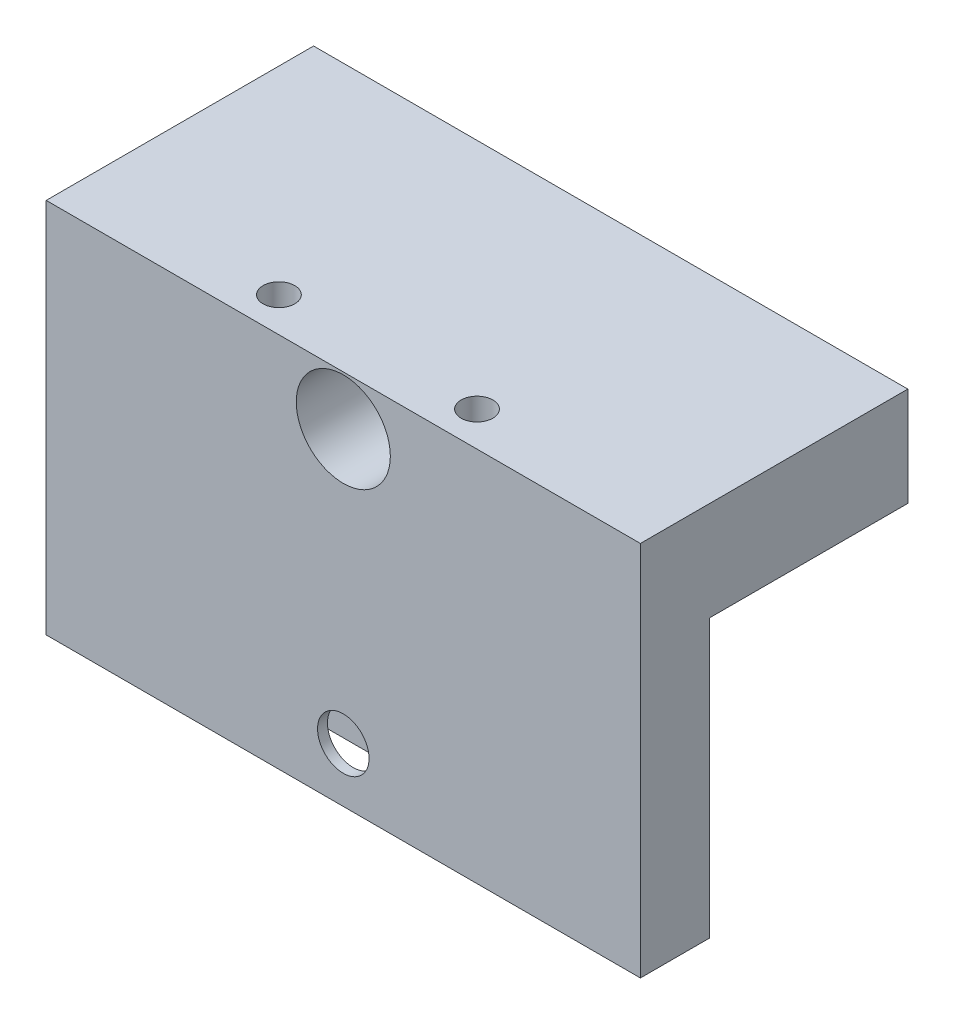
ISO-10303-21;
HEADER;
FILE_DESCRIPTION(('STEP AP214'),'2;1');
FILE_NAME('part.step','',(''),(''),'','','');
FILE_SCHEMA(('AUTOMOTIVE_DESIGN { 1 0 10303 214 1 1 1 1 }'));
ENDSEC;
DATA;
#1=APPLICATION_CONTEXT('core data for automotive mechanical design processes');
#2=APPLICATION_PROTOCOL_DEFINITION('international standard','automotive_design',2000,#1);
#3=PRODUCT_CONTEXT('',#1,'mechanical');
#4=PRODUCT('Part','Part','',(#3));
#5=PRODUCT_RELATED_PRODUCT_CATEGORY('part','',(#4));
#6=PRODUCT_DEFINITION_FORMATION('','',#4);
#7=PRODUCT_DEFINITION_CONTEXT('part definition',#1,'design');
#8=PRODUCT_DEFINITION('design','',#6,#7);
#9=PRODUCT_DEFINITION_SHAPE('','',#8);
#10=(LENGTH_UNIT() NAMED_UNIT(*) SI_UNIT(.MILLI.,.METRE.));
#11=(NAMED_UNIT(*) PLANE_ANGLE_UNIT() SI_UNIT($,.RADIAN.));
#12=(NAMED_UNIT(*) SI_UNIT($,.STERADIAN.) SOLID_ANGLE_UNIT());
#13=UNCERTAINTY_MEASURE_WITH_UNIT(LENGTH_MEASURE(1.E-05),#10,'distance_accuracy_value','');
#14=(GEOMETRIC_REPRESENTATION_CONTEXT(3) GLOBAL_UNCERTAINTY_ASSIGNED_CONTEXT((#13)) GLOBAL_UNIT_ASSIGNED_CONTEXT((#10,
#11,#12)) REPRESENTATION_CONTEXT('',''));
#15=CARTESIAN_POINT('',(0.,0.,0.));
#16=DIRECTION('',(0.,0.,1.));
#17=DIRECTION('',(1.,0.,0.));
#18=AXIS2_PLACEMENT_3D('',#15,#16,#17);
#19=CARTESIAN_POINT('',(0.,0.,0.));
#20=DIRECTION('',(0.,1.,0.));
#21=DIRECTION('',(0.,0.,1.));
#22=AXIS2_PLACEMENT_3D('',#19,#20,#21);
#23=PLANE('',#22);
#24=DIRECTION('',(1.,0.,0.));
#25=VECTOR('',#24,1.);
#26=CARTESIAN_POINT('',(-30.,0.,6.5));
#27=LINE('',#26,#25);
#28=CARTESIAN_POINT('',(-30.,0.,6.5));
#29=VERTEX_POINT('',#28);
#30=CARTESIAN_POINT('',(30.,0.,6.5));
#31=VERTEX_POINT('',#30);
#32=EDGE_CURVE('E75',#29,#31,#27,.T.);
#33=ORIENTED_EDGE('',*,*,#32,.F.);
#34=DIRECTION('',(0.,0.,1.));
#35=VECTOR('',#34,1.);
#36=CARTESIAN_POINT('',(-30.,0.,-13.5));
#37=LINE('',#36,#35);
#38=CARTESIAN_POINT('',(-30.,0.,-13.5));
#39=VERTEX_POINT('',#38);
#40=EDGE_CURVE('E228',#39,#29,#37,.T.);
#41=ORIENTED_EDGE('',*,*,#40,.F.);
#42=DIRECTION('',(-1.,0.,0.));
#43=VECTOR('',#42,1.);
#44=CARTESIAN_POINT('',(-30.,0.,-13.5));
#45=LINE('',#44,#43);
#46=CARTESIAN_POINT('',(30.,0.,-13.5));
#47=VERTEX_POINT('',#46);
#48=EDGE_CURVE('E240',#47,#39,#45,.T.);
#49=ORIENTED_EDGE('',*,*,#48,.F.);
#50=DIRECTION('',(0.,0.,-1.));
#51=VECTOR('',#50,1.);
#52=CARTESIAN_POINT('',(30.,0.,-13.5));
#53=LINE('',#52,#51);
#54=EDGE_CURVE('E222',#31,#47,#53,.T.);
#55=ORIENTED_EDGE('',*,*,#54,.F.);
#56=EDGE_LOOP('',(#33,#41,#49,#55));
#57=FACE_BOUND('',#56,.T.);
#58=ADVANCED_FACE('F49',(#57),#23,.F.);
#59=CARTESIAN_POINT('',(0.,5.,-13.5));
#60=DIRECTION('',(0.,0.,1.));
#61=DIRECTION('',(1.,0.,0.));
#62=AXIS2_PLACEMENT_3D('',#59,#60,#61);
#63=CYLINDRICAL_SURFACE('',#62,2.6);
#64=CARTESIAN_POINT('',(0.,5.,-13.5));
#65=DIRECTION('',(0.,0.,1.));
#66=DIRECTION('',(1.,0.,0.));
#67=AXIS2_PLACEMENT_3D('',#64,#65,#66);
#68=CIRCLE('',#67,2.6);
#69=CARTESIAN_POINT('',(2.6,5.,-13.5));
#70=VERTEX_POINT('',#69);
#71=EDGE_CURVE('E218',#70,#70,#68,.T.);
#72=ORIENTED_EDGE('',*,*,#71,.F.);
#73=EDGE_LOOP('',(#72));
#74=FACE_BOUND('',#73,.T.);
#75=CARTESIAN_POINT('',(0.,5.,-8.5));
#76=DIRECTION('',(0.,0.,1.));
#77=DIRECTION('',(1.,0.,0.));
#78=AXIS2_PLACEMENT_3D('',#75,#76,#77);
#79=CIRCLE('',#78,2.6);
#80=CARTESIAN_POINT('',(2.6,5.,-8.5));
#81=VERTEX_POINT('',#80);
#82=EDGE_CURVE('E217',#81,#81,#79,.F.);
#83=ORIENTED_EDGE('',*,*,#82,.F.);
#84=EDGE_LOOP('',(#83));
#85=FACE_BOUND('',#84,.T.);
#86=ADVANCED_FACE('F310',(#74,#85),#63,.F.);
#87=CARTESIAN_POINT('',(30.,10.,-13.5));
#88=DIRECTION('',(-1.,0.,0.));
#89=DIRECTION('',(0.,0.,1.));
#90=AXIS2_PLACEMENT_3D('',#87,#88,#89);
#91=PLANE('',#90);
#92=DIRECTION('',(0.,-1.,0.));
#93=VECTOR('',#92,1.);
#94=CARTESIAN_POINT('',(30.,10.,13.5));
#95=LINE('',#94,#93);
#96=CARTESIAN_POINT('',(30.,10.,13.5));
#97=VERTEX_POINT('',#96);
#98=CARTESIAN_POINT('',(30.,-28.,13.5));
#99=VERTEX_POINT('',#98);
#100=EDGE_CURVE('E237',#97,#99,#95,.T.);
#101=ORIENTED_EDGE('',*,*,#100,.T.);
#102=DIRECTION('',(0.,0.,1.));
#103=VECTOR('',#102,1.);
#104=CARTESIAN_POINT('',(30.,-28.,13.5));
#105=LINE('',#104,#103);
#106=CARTESIAN_POINT('',(30.,-28.,6.5));
#107=VERTEX_POINT('',#106);
#108=EDGE_CURVE('E191',#107,#99,#105,.T.);
#109=ORIENTED_EDGE('',*,*,#108,.F.);
#110=DIRECTION('',(0.,1.,0.));
#111=VECTOR('',#110,1.);
#112=CARTESIAN_POINT('',(30.,-28.,6.5));
#113=LINE('',#112,#111);
#114=EDGE_CURVE('E199',#107,#31,#113,.T.);
#115=ORIENTED_EDGE('',*,*,#114,.T.);
#116=ORIENTED_EDGE('',*,*,#54,.T.);
#117=DIRECTION('',(0.,-1.,0.));
#118=VECTOR('',#117,1.);
#119=CARTESIAN_POINT('',(30.,10.,-13.5));
#120=LINE('',#119,#118);
#121=CARTESIAN_POINT('',(30.,10.,-13.5));
#122=VERTEX_POINT('',#121);
#123=EDGE_CURVE('E12',#122,#47,#120,.T.);
#124=ORIENTED_EDGE('',*,*,#123,.F.);
#125=DIRECTION('',(0.,0.,-1.));
#126=VECTOR('',#125,1.);
#127=CARTESIAN_POINT('',(30.,10.,-13.5));
#128=LINE('',#127,#126);
#129=EDGE_CURVE('E223',#97,#122,#128,.T.);
#130=ORIENTED_EDGE('',*,*,#129,.F.);
#131=EDGE_LOOP('',(#101,#109,#115,#116,#124,#130));
#132=FACE_BOUND('',#131,.T.);
#133=ADVANCED_FACE('F51',(#132),#91,.F.);
#134=CARTESIAN_POINT('',(-30.,10.,-13.5));
#135=DIRECTION('',(0.,0.,1.));
#136=DIRECTION('',(1.,0.,0.));
#137=AXIS2_PLACEMENT_3D('',#134,#135,#136);
#138=PLANE('',#137);
#139=ORIENTED_EDGE('',*,*,#71,.T.);
#140=EDGE_LOOP('',(#139));
#141=FACE_BOUND('',#140,.T.);
#142=ORIENTED_EDGE('',*,*,#48,.T.);
#143=DIRECTION('',(0.,-1.,0.));
#144=VECTOR('',#143,1.);
#145=CARTESIAN_POINT('',(-30.,10.,-13.5));
#146=LINE('',#145,#144);
#147=CARTESIAN_POINT('',(-30.,10.,-13.5));
#148=VERTEX_POINT('',#147);
#149=EDGE_CURVE('E59',#148,#39,#146,.T.);
#150=ORIENTED_EDGE('',*,*,#149,.F.);
#151=DIRECTION('',(-1.,0.,0.));
#152=VECTOR('',#151,1.);
#153=CARTESIAN_POINT('',(-30.,10.,-13.5));
#154=LINE('',#153,#152);
#155=EDGE_CURVE('E227',#122,#148,#154,.T.);
#156=ORIENTED_EDGE('',*,*,#155,.F.);
#157=ORIENTED_EDGE('',*,*,#123,.T.);
#158=EDGE_LOOP('',(#142,#150,#156,#157));
#159=FACE_BOUND('',#158,.T.);
#160=ADVANCED_FACE('F327',(#141,#159),#138,.F.);
#161=CARTESIAN_POINT('',(-30.,10.,-13.5));
#162=DIRECTION('',(1.,0.,0.));
#163=DIRECTION('',(0.,0.,-1.));
#164=AXIS2_PLACEMENT_3D('',#161,#162,#163);
#165=PLANE('',#164);
#166=ORIENTED_EDGE('',*,*,#40,.T.);
#167=DIRECTION('',(0.,1.,0.));
#168=VECTOR('',#167,1.);
#169=CARTESIAN_POINT('',(-30.,-28.,6.5));
#170=LINE('',#169,#168);
#171=CARTESIAN_POINT('',(-30.,-28.,6.5));
#172=VERTEX_POINT('',#171);
#173=EDGE_CURVE('E205',#172,#29,#170,.T.);
#174=ORIENTED_EDGE('',*,*,#173,.F.);
#175=DIRECTION('',(0.,0.,-1.));
#176=VECTOR('',#175,1.);
#177=CARTESIAN_POINT('',(-30.,-28.,13.5));
#178=LINE('',#177,#176);
#179=CARTESIAN_POINT('',(-30.,-28.,13.5));
#180=VERTEX_POINT('',#179);
#181=EDGE_CURVE('E184',#180,#172,#178,.T.);
#182=ORIENTED_EDGE('',*,*,#181,.F.);
#183=DIRECTION('',(0.,-1.,0.));
#184=VECTOR('',#183,1.);
#185=CARTESIAN_POINT('',(-30.,10.,13.5));
#186=LINE('',#185,#184);
#187=CARTESIAN_POINT('',(-30.,10.,13.5));
#188=VERTEX_POINT('',#187);
#189=EDGE_CURVE('E247',#188,#180,#186,.T.);
#190=ORIENTED_EDGE('',*,*,#189,.F.);
#191=DIRECTION('',(0.,0.,1.));
#192=VECTOR('',#191,1.);
#193=CARTESIAN_POINT('',(-30.,10.,-13.5));
#194=LINE('',#193,#192);
#195=EDGE_CURVE('E231',#148,#188,#194,.T.);
#196=ORIENTED_EDGE('',*,*,#195,.F.);
#197=ORIENTED_EDGE('',*,*,#149,.T.);
#198=EDGE_LOOP('',(#166,#174,#182,#190,#196,#197));
#199=FACE_BOUND('',#198,.T.);
#200=ADVANCED_FACE('F324',(#199),#165,.F.);
#201=CARTESIAN_POINT('',(-30.,10.,13.5));
#202=DIRECTION('',(0.,0.,-1.));
#203=DIRECTION('',(-1.,0.,0.));
#204=AXIS2_PLACEMENT_3D('',#201,#202,#203);
#205=PLANE('',#204);
#206=CARTESIAN_POINT('',(0.,-22.5,13.5));
#207=DIRECTION('',(0.,0.,1.));
#208=DIRECTION('',(1.,0.,0.));
#209=AXIS2_PLACEMENT_3D('',#206,#207,#208);
#210=CIRCLE('',#209,2.6);
#211=CARTESIAN_POINT('',(2.6,-22.5,13.5));
#212=VERTEX_POINT('',#211);
#213=EDGE_CURVE('E260',#212,#212,#210,.T.);
#214=ORIENTED_EDGE('',*,*,#213,.F.);
#215=EDGE_LOOP('',(#214));
#216=FACE_BOUND('',#215,.T.);
#217=CARTESIAN_POINT('',(0.,5.,13.5));
#218=DIRECTION('',(0.,0.,1.));
#219=DIRECTION('',(1.,0.,0.));
#220=AXIS2_PLACEMENT_3D('',#217,#218,#219);
#221=CIRCLE('',#220,4.75);
#222=CARTESIAN_POINT('',(4.75,5.,13.5));
#223=VERTEX_POINT('',#222);
#224=EDGE_CURVE('E209',#223,#223,#221,.T.);
#225=ORIENTED_EDGE('',*,*,#224,.F.);
#226=EDGE_LOOP('',(#225));
#227=FACE_BOUND('',#226,.T.);
#228=ORIENTED_EDGE('',*,*,#189,.T.);
#229=DIRECTION('',(-1.,0.,0.));
#230=VECTOR('',#229,1.);
#231=CARTESIAN_POINT('',(-30.,-28.,13.5));
#232=LINE('',#231,#230);
#233=EDGE_CURVE('E195',#99,#180,#232,.T.);
#234=ORIENTED_EDGE('',*,*,#233,.F.);
#235=ORIENTED_EDGE('',*,*,#100,.F.);
#236=DIRECTION('',(1.,0.,0.));
#237=VECTOR('',#236,1.);
#238=CARTESIAN_POINT('',(-30.,10.,13.5));
#239=LINE('',#238,#237);
#240=EDGE_CURVE('E234',#188,#97,#239,.T.);
#241=ORIENTED_EDGE('',*,*,#240,.F.);
#242=EDGE_LOOP('',(#228,#234,#235,#241));
#243=FACE_BOUND('',#242,.T.);
#244=ADVANCED_FACE('F321',(#216,#227,#243),#205,.F.);
#245=CARTESIAN_POINT('',(0.,10.,0.));
#246=DIRECTION('',(0.,1.,0.));
#247=DIRECTION('',(0.,0.,1.));
#248=AXIS2_PLACEMENT_3D('',#245,#246,#247);
#249=PLANE('',#248);
#250=CARTESIAN_POINT('',(-10.,10.,10.));
#251=DIRECTION('',(0.,1.,0.));
#252=DIRECTION('',(0.,0.,1.));
#253=AXIS2_PLACEMENT_3D('',#250,#251,#252);
#254=CIRCLE('',#253,1.6);
#255=CARTESIAN_POINT('',(-10.,10.,11.6));
#256=VERTEX_POINT('',#255);
#257=EDGE_CURVE('E264',#256,#256,#254,.T.);
#258=ORIENTED_EDGE('',*,*,#257,.F.);
#259=EDGE_LOOP('',(#258));
#260=FACE_BOUND('',#259,.T.);
#261=CARTESIAN_POINT('',(10.,10.,10.));
#262=DIRECTION('',(0.,1.,0.));
#263=DIRECTION('',(0.,0.,1.));
#264=AXIS2_PLACEMENT_3D('',#261,#262,#263);
#265=CIRCLE('',#264,1.6);
#266=CARTESIAN_POINT('',(10.,10.,11.6));
#267=VERTEX_POINT('',#266);
#268=EDGE_CURVE('E271',#267,#267,#265,.T.);
#269=ORIENTED_EDGE('',*,*,#268,.F.);
#270=EDGE_LOOP('',(#269));
#271=FACE_BOUND('',#270,.T.);
#272=ORIENTED_EDGE('',*,*,#129,.T.);
#273=ORIENTED_EDGE('',*,*,#155,.T.);
#274=ORIENTED_EDGE('',*,*,#195,.T.);
#275=ORIENTED_EDGE('',*,*,#240,.T.);
#276=EDGE_LOOP('',(#272,#273,#274,#275));
#277=FACE_BOUND('',#276,.T.);
#278=ADVANCED_FACE('F320',(#260,#271,#277),#249,.T.);
#279=CARTESIAN_POINT('',(-30.,10.,-8.5));
#280=DIRECTION('',(0.,0.,1.));
#281=DIRECTION('',(1.,0.,0.));
#282=AXIS2_PLACEMENT_3D('',#279,#280,#281);
#283=PLANE('',#282);
#284=CARTESIAN_POINT('',(0.,5.,-8.5));
#285=DIRECTION('',(0.,0.,1.));
#286=DIRECTION('',(1.,0.,0.));
#287=AXIS2_PLACEMENT_3D('',#284,#285,#286);
#288=CIRCLE('',#287,4.75);
#289=CARTESIAN_POINT('',(4.75,5.,-8.5));
#290=VERTEX_POINT('',#289);
#291=EDGE_CURVE('E213',#290,#290,#288,.F.);
#292=ORIENTED_EDGE('',*,*,#291,.F.);
#293=EDGE_LOOP('',(#292));
#294=FACE_BOUND('',#293,.T.);
#295=ORIENTED_EDGE('',*,*,#82,.T.);
#296=EDGE_LOOP('',(#295));
#297=FACE_BOUND('',#296,.T.);
#298=ADVANCED_FACE('F360',(#294,#297),#283,.T.);
#299=CARTESIAN_POINT('',(0.,5.,-26.9350288425444));
#300=DIRECTION('',(0.,0.,1.));
#301=DIRECTION('',(1.,0.,0.));
#302=AXIS2_PLACEMENT_3D('',#299,#300,#301);
#303=CYLINDRICAL_SURFACE('',#302,4.75);
#304=ORIENTED_EDGE('',*,*,#291,.T.);
#305=EDGE_LOOP('',(#304));
#306=FACE_BOUND('',#305,.T.);
#307=ORIENTED_EDGE('',*,*,#224,.T.);
#308=EDGE_LOOP('',(#307));
#309=FACE_BOUND('',#308,.T.);
#310=ADVANCED_FACE('F353',(#306,#309),#303,.F.);
#311=CARTESIAN_POINT('',(0.,-28.,0.));
#312=DIRECTION('',(0.,-1.,0.));
#313=DIRECTION('',(0.,0.,-1.));
#314=AXIS2_PLACEMENT_3D('',#311,#312,#313);
#315=PLANE('',#314);
#316=ORIENTED_EDGE('',*,*,#181,.T.);
#317=DIRECTION('',(1.,0.,0.));
#318=VECTOR('',#317,1.);
#319=CARTESIAN_POINT('',(-30.,-28.,6.5));
#320=LINE('',#319,#318);
#321=EDGE_CURVE('E188',#172,#107,#320,.T.);
#322=ORIENTED_EDGE('',*,*,#321,.T.);
#323=ORIENTED_EDGE('',*,*,#108,.T.);
#324=ORIENTED_EDGE('',*,*,#233,.T.);
#325=EDGE_LOOP('',(#316,#322,#323,#324));
#326=FACE_BOUND('',#325,.T.);
#327=DIRECTION('',(-1.,0.,0.));
#328=VECTOR('',#327,1.);
#329=CARTESIAN_POINT('',(-20.,-28.,12.5));
#330=LINE('',#329,#328);
#331=CARTESIAN_POINT('',(20.,-28.,12.5));
#332=VERTEX_POINT('',#331);
#333=CARTESIAN_POINT('',(-20.,-28.,12.5));
#334=VERTEX_POINT('',#333);
#335=EDGE_CURVE('E140',#332,#334,#330,.T.);
#336=ORIENTED_EDGE('',*,*,#335,.F.);
#337=DIRECTION('',(0.,0.,1.));
#338=VECTOR('',#337,1.);
#339=CARTESIAN_POINT('',(20.,-28.,12.5));
#340=LINE('',#339,#338);
#341=CARTESIAN_POINT('',(20.,-28.,7.5));
#342=VERTEX_POINT('',#341);
#343=EDGE_CURVE('E131',#342,#332,#340,.T.);
#344=ORIENTED_EDGE('',*,*,#343,.F.);
#345=DIRECTION('',(1.,0.,0.));
#346=VECTOR('',#345,1.);
#347=CARTESIAN_POINT('',(-20.,-28.,7.5));
#348=LINE('',#347,#346);
#349=CARTESIAN_POINT('',(-20.,-28.,7.5));
#350=VERTEX_POINT('',#349);
#351=EDGE_CURVE('E158',#350,#342,#348,.T.);
#352=ORIENTED_EDGE('',*,*,#351,.F.);
#353=DIRECTION('',(0.,0.,-1.));
#354=VECTOR('',#353,1.);
#355=CARTESIAN_POINT('',(-20.,-28.,12.5));
#356=LINE('',#355,#354);
#357=EDGE_CURVE('E154',#334,#350,#356,.T.);
#358=ORIENTED_EDGE('',*,*,#357,.F.);
#359=EDGE_LOOP('',(#336,#344,#352,#358));
#360=FACE_BOUND('',#359,.T.);
#361=ADVANCED_FACE('F152',(#326,#360),#315,.T.);
#362=CARTESIAN_POINT('',(-30.,-28.,6.5));
#363=DIRECTION('',(0.,0.,1.));
#364=DIRECTION('',(1.,0.,0.));
#365=AXIS2_PLACEMENT_3D('',#362,#363,#364);
#366=PLANE('',#365);
#367=CARTESIAN_POINT('',(0.,-22.5,6.5));
#368=DIRECTION('',(0.,0.,1.));
#369=DIRECTION('',(1.,0.,0.));
#370=AXIS2_PLACEMENT_3D('',#367,#368,#369);
#371=CIRCLE('',#370,2.6);
#372=CARTESIAN_POINT('',(2.6,-22.5,6.5));
#373=VERTEX_POINT('',#372);
#374=EDGE_CURVE('E167',#373,#373,#371,.T.);
#375=ORIENTED_EDGE('',*,*,#374,.T.);
#376=EDGE_LOOP('',(#375));
#377=FACE_BOUND('',#376,.T.);
#378=ORIENTED_EDGE('',*,*,#32,.T.);
#379=ORIENTED_EDGE('',*,*,#114,.F.);
#380=ORIENTED_EDGE('',*,*,#321,.F.);
#381=ORIENTED_EDGE('',*,*,#173,.T.);
#382=EDGE_LOOP('',(#378,#379,#380,#381));
#383=FACE_BOUND('',#382,.T.);
#384=ADVANCED_FACE('F288',(#377,#383),#366,.F.);
#385=CARTESIAN_POINT('',(20.,-28.,12.5));
#386=DIRECTION('',(-1.,0.,0.));
#387=DIRECTION('',(0.,0.,1.));
#388=AXIS2_PLACEMENT_3D('',#385,#386,#387);
#389=PLANE('',#388);
#390=DIRECTION('',(0.,0.,1.));
#391=VECTOR('',#390,1.);
#392=CARTESIAN_POINT('',(20.,0.,12.5));
#393=LINE('',#392,#391);
#394=CARTESIAN_POINT('',(20.,0.,7.5));
#395=VERTEX_POINT('',#394);
#396=CARTESIAN_POINT('',(20.,0.,12.5));
#397=VERTEX_POINT('',#396);
#398=EDGE_CURVE('E164',#395,#397,#393,.T.);
#399=ORIENTED_EDGE('',*,*,#398,.F.);
#400=DIRECTION('',(0.,1.,0.));
#401=VECTOR('',#400,1.);
#402=CARTESIAN_POINT('',(20.,-28.,7.5));
#403=LINE('',#402,#401);
#404=EDGE_CURVE('E67',#342,#395,#403,.T.);
#405=ORIENTED_EDGE('',*,*,#404,.F.);
#406=ORIENTED_EDGE('',*,*,#343,.T.);
#407=DIRECTION('',(0.,1.,0.));
#408=VECTOR('',#407,1.);
#409=CARTESIAN_POINT('',(20.,-28.,12.5));
#410=LINE('',#409,#408);
#411=EDGE_CURVE('E134',#332,#397,#410,.T.);
#412=ORIENTED_EDGE('',*,*,#411,.T.);
#413=EDGE_LOOP('',(#399,#405,#406,#412));
#414=FACE_BOUND('',#413,.T.);
#415=ADVANCED_FACE('F133',(#414),#389,.T.);
#416=CARTESIAN_POINT('',(-20.,-28.,12.5));
#417=DIRECTION('',(0.,0.,-1.));
#418=DIRECTION('',(-1.,0.,0.));
#419=AXIS2_PLACEMENT_3D('',#416,#417,#418);
#420=PLANE('',#419);
#421=CARTESIAN_POINT('',(0.,-22.5,12.5));
#422=DIRECTION('',(0.,0.,-1.));
#423=DIRECTION('',(-1.,0.,0.));
#424=AXIS2_PLACEMENT_3D('',#421,#422,#423);
#425=CIRCLE('',#424,2.6);
#426=CARTESIAN_POINT('',(-2.6,-22.5,12.5));
#427=VERTEX_POINT('',#426);
#428=EDGE_CURVE('E259',#427,#427,#425,.T.);
#429=ORIENTED_EDGE('',*,*,#428,.F.);
#430=EDGE_LOOP('',(#429));
#431=FACE_BOUND('',#430,.T.);
#432=DIRECTION('',(-1.,0.,0.));
#433=VECTOR('',#432,1.);
#434=CARTESIAN_POINT('',(-20.,0.,12.5));
#435=LINE('',#434,#433);
#436=CARTESIAN_POINT('',(-20.,0.,12.5));
#437=VERTEX_POINT('',#436);
#438=EDGE_CURVE('E147',#397,#437,#435,.T.);
#439=ORIENTED_EDGE('',*,*,#438,.F.);
#440=ORIENTED_EDGE('',*,*,#411,.F.);
#441=ORIENTED_EDGE('',*,*,#335,.T.);
#442=DIRECTION('',(0.,1.,0.));
#443=VECTOR('',#442,1.);
#444=CARTESIAN_POINT('',(-20.,-28.,12.5));
#445=LINE('',#444,#443);
#446=EDGE_CURVE('E149',#334,#437,#445,.T.);
#447=ORIENTED_EDGE('',*,*,#446,.T.);
#448=EDGE_LOOP('',(#439,#440,#441,#447));
#449=FACE_BOUND('',#448,.T.);
#450=ADVANCED_FACE('F144',(#431,#449),#420,.T.);
#451=CARTESIAN_POINT('',(-20.,-28.,12.5));
#452=DIRECTION('',(1.,0.,0.));
#453=DIRECTION('',(0.,0.,-1.));
#454=AXIS2_PLACEMENT_3D('',#451,#452,#453);
#455=PLANE('',#454);
#456=DIRECTION('',(0.,0.,-1.));
#457=VECTOR('',#456,1.);
#458=CARTESIAN_POINT('',(-20.,0.,12.5));
#459=LINE('',#458,#457);
#460=CARTESIAN_POINT('',(-20.,0.,7.5));
#461=VERTEX_POINT('',#460);
#462=EDGE_CURVE('E170',#437,#461,#459,.T.);
#463=ORIENTED_EDGE('',*,*,#462,.F.);
#464=ORIENTED_EDGE('',*,*,#446,.F.);
#465=ORIENTED_EDGE('',*,*,#357,.T.);
#466=DIRECTION('',(0.,1.,0.));
#467=VECTOR('',#466,1.);
#468=CARTESIAN_POINT('',(-20.,-28.,7.5));
#469=LINE('',#468,#467);
#470=EDGE_CURVE('E179',#350,#461,#469,.T.);
#471=ORIENTED_EDGE('',*,*,#470,.T.);
#472=EDGE_LOOP('',(#463,#464,#465,#471));
#473=FACE_BOUND('',#472,.T.);
#474=ADVANCED_FACE('F398',(#473),#455,.T.);
#475=CARTESIAN_POINT('',(-20.,-28.,7.5));
#476=DIRECTION('',(0.,0.,1.));
#477=DIRECTION('',(1.,0.,0.));
#478=AXIS2_PLACEMENT_3D('',#475,#476,#477);
#479=PLANE('',#478);
#480=CARTESIAN_POINT('',(0.,-22.5,7.5));
#481=DIRECTION('',(0.,0.,1.));
#482=DIRECTION('',(1.,0.,0.));
#483=AXIS2_PLACEMENT_3D('',#480,#481,#482);
#484=CIRCLE('',#483,2.6);
#485=CARTESIAN_POINT('',(2.6,-22.5,7.5));
#486=VERTEX_POINT('',#485);
#487=EDGE_CURVE('E256',#486,#486,#484,.T.);
#488=ORIENTED_EDGE('',*,*,#487,.F.);
#489=EDGE_LOOP('',(#488));
#490=FACE_BOUND('',#489,.T.);
#491=DIRECTION('',(1.,0.,0.));
#492=VECTOR('',#491,1.);
#493=CARTESIAN_POINT('',(-20.,0.,7.5));
#494=LINE('',#493,#492);
#495=EDGE_CURVE('E141',#461,#395,#494,.T.);
#496=ORIENTED_EDGE('',*,*,#495,.F.);
#497=ORIENTED_EDGE('',*,*,#470,.F.);
#498=ORIENTED_EDGE('',*,*,#351,.T.);
#499=ORIENTED_EDGE('',*,*,#404,.T.);
#500=EDGE_LOOP('',(#496,#497,#498,#499));
#501=FACE_BOUND('',#500,.T.);
#502=ADVANCED_FACE('F304',(#490,#501),#479,.T.);
#503=CARTESIAN_POINT('',(-10.,0.,10.));
#504=DIRECTION('',(0.,1.,0.));
#505=DIRECTION('',(0.,0.,1.));
#506=AXIS2_PLACEMENT_3D('',#503,#504,#505);
#507=CIRCLE('',#506,1.6);
#508=CARTESIAN_POINT('',(-10.,0.,11.6));
#509=VERTEX_POINT('',#508);
#510=EDGE_CURVE('E53',#509,#509,#507,.T.);
#511=ORIENTED_EDGE('',*,*,#510,.T.);
#512=EDGE_LOOP('',(#511));
#513=FACE_BOUND('',#512,.T.);
#514=CARTESIAN_POINT('',(10.,0.,10.));
#515=DIRECTION('',(0.,1.,0.));
#516=DIRECTION('',(0.,0.,1.));
#517=AXIS2_PLACEMENT_3D('',#514,#515,#516);
#518=CIRCLE('',#517,1.6);
#519=CARTESIAN_POINT('',(10.,0.,11.6));
#520=VERTEX_POINT('',#519);
#521=EDGE_CURVE('E261',#520,#520,#518,.T.);
#522=ORIENTED_EDGE('',*,*,#521,.T.);
#523=EDGE_LOOP('',(#522));
#524=FACE_BOUND('',#523,.T.);
#525=ORIENTED_EDGE('',*,*,#495,.T.);
#526=ORIENTED_EDGE('',*,*,#398,.T.);
#527=ORIENTED_EDGE('',*,*,#438,.T.);
#528=ORIENTED_EDGE('',*,*,#462,.T.);
#529=EDGE_LOOP('',(#525,#526,#527,#528));
#530=FACE_BOUND('',#529,.T.);
#531=ADVANCED_FACE('F294',(#513,#524,#530),#23,.F.);
#532=CARTESIAN_POINT('',(0.,-22.5,-13.5));
#533=DIRECTION('',(0.,0.,1.));
#534=DIRECTION('',(1.,0.,0.));
#535=AXIS2_PLACEMENT_3D('',#532,#533,#534);
#536=CYLINDRICAL_SURFACE('',#535,2.6);
#537=ORIENTED_EDGE('',*,*,#487,.T.);
#538=EDGE_LOOP('',(#537));
#539=FACE_BOUND('',#538,.T.);
#540=ORIENTED_EDGE('',*,*,#374,.F.);
#541=EDGE_LOOP('',(#540));
#542=FACE_BOUND('',#541,.T.);
#543=ADVANCED_FACE('F291',(#539,#542),#536,.F.);
#544=ORIENTED_EDGE('',*,*,#428,.T.);
#545=EDGE_LOOP('',(#544));
#546=FACE_BOUND('',#545,.T.);
#547=ORIENTED_EDGE('',*,*,#213,.T.);
#548=EDGE_LOOP('',(#547));
#549=FACE_BOUND('',#548,.T.);
#550=ADVANCED_FACE('F293',(#546,#549),#536,.F.);
#551=CARTESIAN_POINT('',(10.,-28.,10.));
#552=DIRECTION('',(0.,1.,0.));
#553=DIRECTION('',(0.,0.,1.));
#554=AXIS2_PLACEMENT_3D('',#551,#552,#553);
#555=CYLINDRICAL_SURFACE('',#554,1.6);
#556=ORIENTED_EDGE('',*,*,#268,.T.);
#557=EDGE_LOOP('',(#556));
#558=FACE_BOUND('',#557,.T.);
#559=ORIENTED_EDGE('',*,*,#521,.F.);
#560=EDGE_LOOP('',(#559));
#561=FACE_BOUND('',#560,.T.);
#562=ADVANCED_FACE('F301',(#558,#561),#555,.F.);
#563=CARTESIAN_POINT('',(-10.,-28.,10.));
#564=DIRECTION('',(0.,1.,0.));
#565=DIRECTION('',(0.,0.,1.));
#566=AXIS2_PLACEMENT_3D('',#563,#564,#565);
#567=CYLINDRICAL_SURFACE('',#566,1.6);
#568=ORIENTED_EDGE('',*,*,#257,.T.);
#569=EDGE_LOOP('',(#568));
#570=FACE_BOUND('',#569,.T.);
#571=ORIENTED_EDGE('',*,*,#510,.F.);
#572=EDGE_LOOP('',(#571));
#573=FACE_BOUND('',#572,.T.);
#574=ADVANCED_FACE('F386',(#570,#573),#567,.F.);
#575=CLOSED_SHELL('',(#58,#86,#133,#160,#200,#244,#278,#298,#310,#361,#384,#415,#450,#474,#502,
#531,#543,#550,#562,#574));
#576=MANIFOLD_SOLID_BREP('B2',#575);
#577=ADVANCED_BREP_SHAPE_REPRESENTATION('',(#18,#576),#14);
#578=SHAPE_DEFINITION_REPRESENTATION(#9,#577);
ENDSEC;
END-ISO-10303-21;
